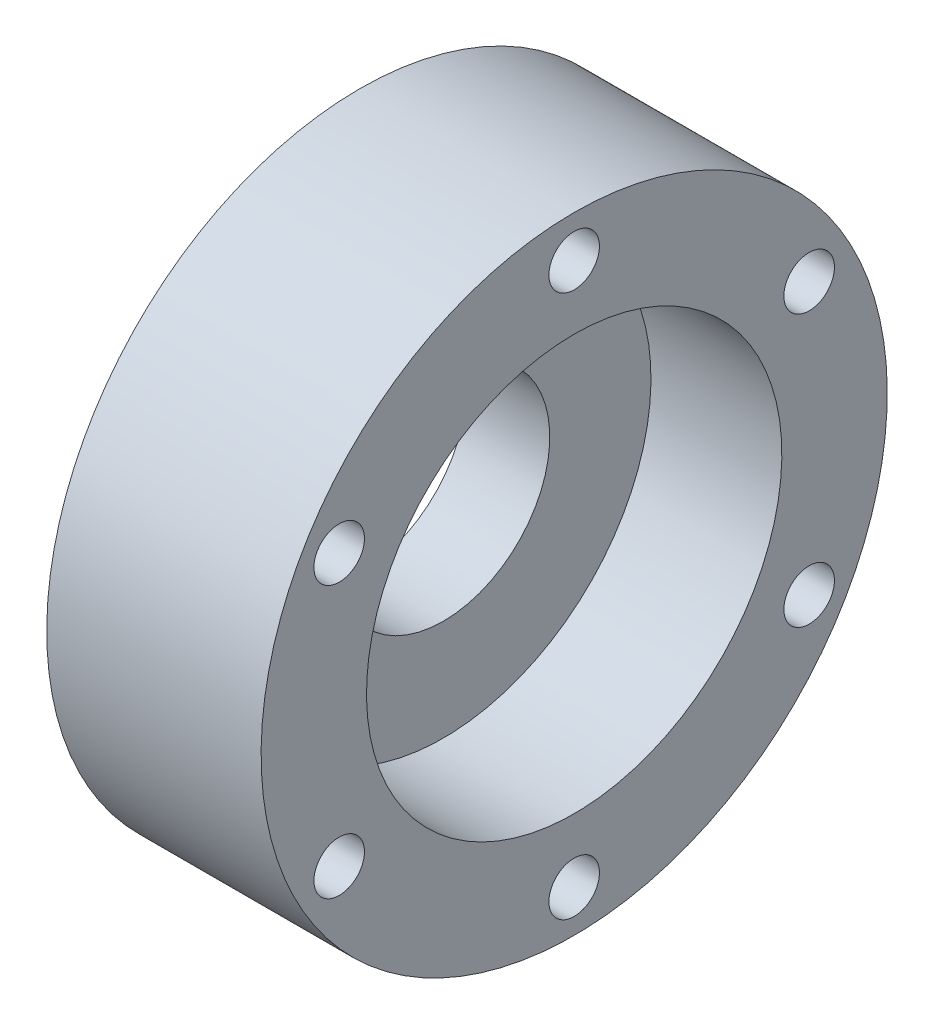
ISO-10303-21;
HEADER;
FILE_DESCRIPTION(('STEP AP214'),'2;1');
FILE_NAME('part.step','',(''),(''),'','','');
FILE_SCHEMA(('AUTOMOTIVE_DESIGN { 1 0 10303 214 1 1 1 1 }'));
ENDSEC;
DATA;
#1=APPLICATION_CONTEXT('core data for automotive mechanical design processes');
#2=APPLICATION_PROTOCOL_DEFINITION('international standard','automotive_design',2000,#1);
#3=PRODUCT_CONTEXT('',#1,'mechanical');
#4=PRODUCT('Part','Part','',(#3));
#5=PRODUCT_RELATED_PRODUCT_CATEGORY('part','',(#4));
#6=PRODUCT_DEFINITION_FORMATION('','',#4);
#7=PRODUCT_DEFINITION_CONTEXT('part definition',#1,'design');
#8=PRODUCT_DEFINITION('design','',#6,#7);
#9=PRODUCT_DEFINITION_SHAPE('','',#8);
#10=(LENGTH_UNIT() NAMED_UNIT(*) SI_UNIT(.MILLI.,.METRE.));
#11=(NAMED_UNIT(*) PLANE_ANGLE_UNIT() SI_UNIT($,.RADIAN.));
#12=(NAMED_UNIT(*) SI_UNIT($,.STERADIAN.) SOLID_ANGLE_UNIT());
#13=UNCERTAINTY_MEASURE_WITH_UNIT(LENGTH_MEASURE(1.E-05),#10,'distance_accuracy_value','');
#14=(GEOMETRIC_REPRESENTATION_CONTEXT(3) GLOBAL_UNCERTAINTY_ASSIGNED_CONTEXT((#13)) GLOBAL_UNIT_ASSIGNED_CONTEXT((#10,
#11,#12)) REPRESENTATION_CONTEXT('',''));
#15=CARTESIAN_POINT('',(0.,0.,0.));
#16=DIRECTION('',(0.,0.,1.));
#17=DIRECTION('',(1.,0.,0.));
#18=AXIS2_PLACEMENT_3D('',#15,#16,#17);
#19=CARTESIAN_POINT('',(0.,0.,0.));
#20=DIRECTION('',(-1.,0.,0.));
#21=DIRECTION('',(0.,-1.,0.));
#22=AXIS2_PLACEMENT_3D('',#19,#20,#21);
#23=PLANE('',#22);
#24=CARTESIAN_POINT('',(0.,16.51,0.));
#25=DIRECTION('',(-1.,0.,0.));
#26=DIRECTION('',(0.,-1.,0.));
#27=AXIS2_PLACEMENT_3D('',#24,#25,#26);
#28=CIRCLE('',#27,1.53814530793123);
#29=CARTESIAN_POINT('',(0.,14.9718546920688,0.));
#30=VERTEX_POINT('',#29);
#31=EDGE_CURVE('E78',#30,#30,#28,.T.);
#32=ORIENTED_EDGE('',*,*,#31,.F.);
#33=EDGE_LOOP('',(#32));
#34=FACE_BOUND('',#33,.T.);
#35=CARTESIAN_POINT('',(0.,8.2549999999992,-14.2980794164806));
#36=DIRECTION('',(-1.,0.,0.));
#37=DIRECTION('',(0.,-1.,0.));
#38=AXIS2_PLACEMENT_3D('',#35,#36,#37);
#39=CIRCLE('',#38,1.53814530793123);
#40=CARTESIAN_POINT('',(0.,6.71685469206797,-14.2980794164806));
#41=VERTEX_POINT('',#40);
#42=EDGE_CURVE('E79',#41,#41,#39,.T.);
#43=ORIENTED_EDGE('',*,*,#42,.F.);
#44=EDGE_LOOP('',(#43));
#45=FACE_BOUND('',#44,.T.);
#46=CARTESIAN_POINT('',(0.,-8.2550000000008,-14.2980794164797));
#47=DIRECTION('',(-1.,0.,0.));
#48=DIRECTION('',(0.,-1.,0.));
#49=AXIS2_PLACEMENT_3D('',#46,#47,#48);
#50=CIRCLE('',#49,1.53814530793123);
#51=CARTESIAN_POINT('',(0.,-9.79314530793203,-14.2980794164797));
#52=VERTEX_POINT('',#51);
#53=EDGE_CURVE('E53',#52,#52,#50,.T.);
#54=ORIENTED_EDGE('',*,*,#53,.F.);
#55=EDGE_LOOP('',(#54));
#56=FACE_BOUND('',#55,.T.);
#57=CARTESIAN_POINT('',(0.,-16.51,1.83496397435458E-12));
#58=DIRECTION('',(-1.,0.,0.));
#59=DIRECTION('',(0.,-1.,0.));
#60=AXIS2_PLACEMENT_3D('',#57,#58,#59);
#61=CIRCLE('',#60,1.53814530793123);
#62=CARTESIAN_POINT('',(0.,-18.0481453079312,1.83496397435458E-12));
#63=VERTEX_POINT('',#62);
#64=EDGE_CURVE('E60',#63,#63,#61,.T.);
#65=ORIENTED_EDGE('',*,*,#64,.F.);
#66=EDGE_LOOP('',(#65));
#67=FACE_BOUND('',#66,.T.);
#68=CARTESIAN_POINT('',(0.,-8.2549999999992,14.2980794164825));
#69=DIRECTION('',(-1.,0.,0.));
#70=DIRECTION('',(0.,-1.,0.));
#71=AXIS2_PLACEMENT_3D('',#68,#69,#70);
#72=CIRCLE('',#71,1.53814530793122);
#73=CARTESIAN_POINT('',(0.,-9.79314530793043,14.2980794164825));
#74=VERTEX_POINT('',#73);
#75=EDGE_CURVE('E66',#74,#74,#72,.T.);
#76=ORIENTED_EDGE('',*,*,#75,.F.);
#77=EDGE_LOOP('',(#76));
#78=FACE_BOUND('',#77,.T.);
#79=CARTESIAN_POINT('',(0.,8.2550000000008,14.2980794164815));
#80=DIRECTION('',(-1.,0.,0.));
#81=DIRECTION('',(0.,-1.,0.));
#82=AXIS2_PLACEMENT_3D('',#79,#80,#81);
#83=CIRCLE('',#82,1.53814530793123);
#84=CARTESIAN_POINT('',(0.,6.71685469206957,14.2980794164815));
#85=VERTEX_POINT('',#84);
#86=EDGE_CURVE('E72',#85,#85,#83,.T.);
#87=ORIENTED_EDGE('',*,*,#86,.F.);
#88=EDGE_LOOP('',(#87));
#89=FACE_BOUND('',#88,.T.);
#90=CARTESIAN_POINT('',(0.,0.,0.));
#91=DIRECTION('',(-1.,0.,0.));
#92=DIRECTION('',(0.,-1.,0.));
#93=AXIS2_PLACEMENT_3D('',#90,#91,#92);
#94=CIRCLE('',#93,6.477);
#95=CARTESIAN_POINT('',(0.,-6.477,0.));
#96=VERTEX_POINT('',#95);
#97=EDGE_CURVE('E49',#96,#96,#94,.T.);
#98=ORIENTED_EDGE('',*,*,#97,.F.);
#99=EDGE_LOOP('',(#98));
#100=FACE_BOUND('',#99,.T.);
#101=CARTESIAN_POINT('',(0.,0.,0.));
#102=DIRECTION('',(1.,0.,0.));
#103=DIRECTION('',(0.,1.,0.));
#104=AXIS2_PLACEMENT_3D('',#101,#102,#103);
#105=CIRCLE('',#104,19.05);
#106=CARTESIAN_POINT('',(0.,19.05,0.));
#107=VERTEX_POINT('',#106);
#108=EDGE_CURVE('E10',#107,#107,#105,.T.);
#109=ORIENTED_EDGE('',*,*,#108,.F.);
#110=EDGE_LOOP('',(#109));
#111=FACE_BOUND('',#110,.T.);
#112=ADVANCED_FACE('F30',(#34,#45,#56,#67,#78,#89,#100,#111),#23,.T.);
#113=CARTESIAN_POINT('',(5.08,0.,0.));
#114=DIRECTION('',(1.,0.,0.));
#115=DIRECTION('',(0.,1.,0.));
#116=AXIS2_PLACEMENT_3D('',#113,#114,#115);
#117=CYLINDRICAL_SURFACE('',#116,19.05);
#118=ORIENTED_EDGE('',*,*,#108,.T.);
#119=EDGE_LOOP('',(#118));
#120=FACE_BOUND('',#119,.T.);
#121=CARTESIAN_POINT('',(13.0429,0.,0.));
#122=DIRECTION('',(1.,0.,0.));
#123=DIRECTION('',(0.,1.,0.));
#124=AXIS2_PLACEMENT_3D('',#121,#122,#123);
#125=CIRCLE('',#124,19.05);
#126=CARTESIAN_POINT('',(13.0429,19.05,0.));
#127=VERTEX_POINT('',#126);
#128=EDGE_CURVE('E37',#127,#127,#125,.T.);
#129=ORIENTED_EDGE('',*,*,#128,.F.);
#130=EDGE_LOOP('',(#129));
#131=FACE_BOUND('',#130,.T.);
#132=ADVANCED_FACE('F101',(#120,#131),#117,.T.);
#133=CARTESIAN_POINT('',(13.0429,19.05,0.));
#134=DIRECTION('',(1.,0.,0.));
#135=DIRECTION('',(0.,1.,0.));
#136=AXIS2_PLACEMENT_3D('',#133,#134,#135);
#137=PLANE('',#136);
#138=CARTESIAN_POINT('',(13.0429,16.51,0.));
#139=DIRECTION('',(-1.,0.,0.));
#140=DIRECTION('',(0.,-1.,0.));
#141=AXIS2_PLACEMENT_3D('',#138,#139,#140);
#142=CIRCLE('',#141,1.53814530793123);
#143=CARTESIAN_POINT('',(13.0429,14.9718546920688,0.));
#144=VERTEX_POINT('',#143);
#145=EDGE_CURVE('E52',#144,#144,#142,.T.);
#146=ORIENTED_EDGE('',*,*,#145,.T.);
#147=EDGE_LOOP('',(#146));
#148=FACE_BOUND('',#147,.T.);
#149=CARTESIAN_POINT('',(13.0429,8.2549999999992,-14.2980794164806));
#150=DIRECTION('',(-1.,0.,0.));
#151=DIRECTION('',(0.,-1.,0.));
#152=AXIS2_PLACEMENT_3D('',#149,#150,#151);
#153=CIRCLE('',#152,1.53814530793123);
#154=CARTESIAN_POINT('',(13.0429,6.71685469206797,-14.2980794164806));
#155=VERTEX_POINT('',#154);
#156=EDGE_CURVE('E57',#155,#155,#153,.T.);
#157=ORIENTED_EDGE('',*,*,#156,.T.);
#158=EDGE_LOOP('',(#157));
#159=FACE_BOUND('',#158,.T.);
#160=CARTESIAN_POINT('',(13.0429,-8.2550000000008,-14.2980794164797));
#161=DIRECTION('',(-1.,0.,0.));
#162=DIRECTION('',(0.,-1.,0.));
#163=AXIS2_PLACEMENT_3D('',#160,#161,#162);
#164=CIRCLE('',#163,1.53814530793123);
#165=CARTESIAN_POINT('',(13.0429,-9.79314530793203,-14.2980794164797));
#166=VERTEX_POINT('',#165);
#167=EDGE_CURVE('E56',#166,#166,#164,.T.);
#168=ORIENTED_EDGE('',*,*,#167,.T.);
#169=EDGE_LOOP('',(#168));
#170=FACE_BOUND('',#169,.T.);
#171=CARTESIAN_POINT('',(13.0429,-16.51,1.83496397435458E-12));
#172=DIRECTION('',(-1.,0.,0.));
#173=DIRECTION('',(0.,-1.,0.));
#174=AXIS2_PLACEMENT_3D('',#171,#172,#173);
#175=CIRCLE('',#174,1.53814530793123);
#176=CARTESIAN_POINT('',(13.0429,-18.0481453079312,1.83496397435458E-12));
#177=VERTEX_POINT('',#176);
#178=EDGE_CURVE('E63',#177,#177,#175,.T.);
#179=ORIENTED_EDGE('',*,*,#178,.T.);
#180=EDGE_LOOP('',(#179));
#181=FACE_BOUND('',#180,.T.);
#182=CARTESIAN_POINT('',(13.0429,-8.2549999999992,14.2980794164825));
#183=DIRECTION('',(-1.,0.,0.));
#184=DIRECTION('',(0.,-1.,0.));
#185=AXIS2_PLACEMENT_3D('',#182,#183,#184);
#186=CIRCLE('',#185,1.53814530793122);
#187=CARTESIAN_POINT('',(13.0429,-9.79314530793043,14.2980794164825));
#188=VERTEX_POINT('',#187);
#189=EDGE_CURVE('E69',#188,#188,#186,.T.);
#190=ORIENTED_EDGE('',*,*,#189,.T.);
#191=EDGE_LOOP('',(#190));
#192=FACE_BOUND('',#191,.T.);
#193=CARTESIAN_POINT('',(13.0429,8.2550000000008,14.2980794164815));
#194=DIRECTION('',(-1.,0.,0.));
#195=DIRECTION('',(0.,-1.,0.));
#196=AXIS2_PLACEMENT_3D('',#193,#194,#195);
#197=CIRCLE('',#196,1.53814530793123);
#198=CARTESIAN_POINT('',(13.0429,6.71685469206957,14.2980794164815));
#199=VERTEX_POINT('',#198);
#200=EDGE_CURVE('E75',#199,#199,#197,.T.);
#201=ORIENTED_EDGE('',*,*,#200,.T.);
#202=EDGE_LOOP('',(#201));
#203=FACE_BOUND('',#202,.T.);
#204=ORIENTED_EDGE('',*,*,#128,.T.);
#205=EDGE_LOOP('',(#204));
#206=FACE_BOUND('',#205,.T.);
#207=CARTESIAN_POINT('',(13.0429,0.,0.));
#208=DIRECTION('',(1.,0.,0.));
#209=DIRECTION('',(0.,1.,0.));
#210=AXIS2_PLACEMENT_3D('',#207,#208,#209);
#211=CIRCLE('',#210,12.6365);
#212=CARTESIAN_POINT('',(13.0429,12.6365,0.));
#213=VERTEX_POINT('',#212);
#214=EDGE_CURVE('E41',#213,#213,#211,.T.);
#215=ORIENTED_EDGE('',*,*,#214,.F.);
#216=EDGE_LOOP('',(#215));
#217=FACE_BOUND('',#216,.T.);
#218=ADVANCED_FACE('F89',(#148,#159,#170,#181,#192,#203,#206,#217),#137,.T.);
#219=CARTESIAN_POINT('',(5.08,0.,0.));
#220=DIRECTION('',(1.,0.,0.));
#221=DIRECTION('',(0.,1.,0.));
#222=AXIS2_PLACEMENT_3D('',#219,#220,#221);
#223=CYLINDRICAL_SURFACE('',#222,12.6365);
#224=ORIENTED_EDGE('',*,*,#214,.T.);
#225=EDGE_LOOP('',(#224));
#226=FACE_BOUND('',#225,.T.);
#227=CARTESIAN_POINT('',(5.08,0.,0.));
#228=DIRECTION('',(1.,0.,0.));
#229=DIRECTION('',(0.,1.,0.));
#230=AXIS2_PLACEMENT_3D('',#227,#228,#229);
#231=CIRCLE('',#230,12.6365);
#232=CARTESIAN_POINT('',(5.08,12.6365,0.));
#233=VERTEX_POINT('',#232);
#234=EDGE_CURVE('E46',#233,#233,#231,.T.);
#235=ORIENTED_EDGE('',*,*,#234,.F.);
#236=EDGE_LOOP('',(#235));
#237=FACE_BOUND('',#236,.T.);
#238=ADVANCED_FACE('F128',(#226,#237),#223,.F.);
#239=CARTESIAN_POINT('',(5.08,12.6365,0.));
#240=DIRECTION('',(1.,0.,0.));
#241=DIRECTION('',(0.,1.,0.));
#242=AXIS2_PLACEMENT_3D('',#239,#240,#241);
#243=PLANE('',#242);
#244=CARTESIAN_POINT('',(5.08,0.,0.));
#245=DIRECTION('',(1.,0.,0.));
#246=DIRECTION('',(0.,1.,0.));
#247=AXIS2_PLACEMENT_3D('',#244,#245,#246);
#248=CIRCLE('',#247,6.477);
#249=CARTESIAN_POINT('',(5.08,6.477,0.));
#250=VERTEX_POINT('',#249);
#251=EDGE_CURVE('E33',#250,#250,#248,.T.);
#252=ORIENTED_EDGE('',*,*,#251,.F.);
#253=EDGE_LOOP('',(#252));
#254=FACE_BOUND('',#253,.T.);
#255=ORIENTED_EDGE('',*,*,#234,.T.);
#256=EDGE_LOOP('',(#255));
#257=FACE_BOUND('',#256,.T.);
#258=ADVANCED_FACE('F118',(#254,#257),#243,.T.);
#259=CARTESIAN_POINT('',(13.0429,0.,0.));
#260=DIRECTION('',(-1.,0.,0.));
#261=DIRECTION('',(0.,-1.,0.));
#262=AXIS2_PLACEMENT_3D('',#259,#260,#261);
#263=CYLINDRICAL_SURFACE('',#262,6.477);
#264=ORIENTED_EDGE('',*,*,#251,.T.);
#265=EDGE_LOOP('',(#264));
#266=FACE_BOUND('',#265,.T.);
#267=ORIENTED_EDGE('',*,*,#97,.T.);
#268=EDGE_LOOP('',(#267));
#269=FACE_BOUND('',#268,.T.);
#270=ADVANCED_FACE('F115',(#266,#269),#263,.F.);
#271=CARTESIAN_POINT('',(13.0429,8.2550000000008,14.2980794164815));
#272=DIRECTION('',(-1.,0.,0.));
#273=DIRECTION('',(0.,-1.,0.));
#274=AXIS2_PLACEMENT_3D('',#271,#272,#273);
#275=CYLINDRICAL_SURFACE('',#274,1.53814530793123);
#276=ORIENTED_EDGE('',*,*,#200,.F.);
#277=EDGE_LOOP('',(#276));
#278=FACE_BOUND('',#277,.T.);
#279=ORIENTED_EDGE('',*,*,#86,.T.);
#280=EDGE_LOOP('',(#279));
#281=FACE_BOUND('',#280,.T.);
#282=ADVANCED_FACE('F117',(#278,#281),#275,.F.);
#283=CARTESIAN_POINT('',(13.0429,-8.2549999999992,14.2980794164825));
#284=DIRECTION('',(-1.,0.,0.));
#285=DIRECTION('',(0.,-1.,0.));
#286=AXIS2_PLACEMENT_3D('',#283,#284,#285);
#287=CYLINDRICAL_SURFACE('',#286,1.53814530793122);
#288=ORIENTED_EDGE('',*,*,#189,.F.);
#289=EDGE_LOOP('',(#288));
#290=FACE_BOUND('',#289,.T.);
#291=ORIENTED_EDGE('',*,*,#75,.T.);
#292=EDGE_LOOP('',(#291));
#293=FACE_BOUND('',#292,.T.);
#294=ADVANCED_FACE('F125',(#290,#293),#287,.F.);
#295=CARTESIAN_POINT('',(13.0429,-16.51,1.83496397435458E-12));
#296=DIRECTION('',(-1.,0.,0.));
#297=DIRECTION('',(0.,-1.,0.));
#298=AXIS2_PLACEMENT_3D('',#295,#296,#297);
#299=CYLINDRICAL_SURFACE('',#298,1.53814530793123);
#300=ORIENTED_EDGE('',*,*,#178,.F.);
#301=EDGE_LOOP('',(#300));
#302=FACE_BOUND('',#301,.T.);
#303=ORIENTED_EDGE('',*,*,#64,.T.);
#304=EDGE_LOOP('',(#303));
#305=FACE_BOUND('',#304,.T.);
#306=ADVANCED_FACE('F194',(#302,#305),#299,.F.);
#307=CARTESIAN_POINT('',(13.0429,-8.2550000000008,-14.2980794164797));
#308=DIRECTION('',(-1.,0.,0.));
#309=DIRECTION('',(0.,-1.,0.));
#310=AXIS2_PLACEMENT_3D('',#307,#308,#309);
#311=CYLINDRICAL_SURFACE('',#310,1.53814530793123);
#312=ORIENTED_EDGE('',*,*,#167,.F.);
#313=EDGE_LOOP('',(#312));
#314=FACE_BOUND('',#313,.T.);
#315=ORIENTED_EDGE('',*,*,#53,.T.);
#316=EDGE_LOOP('',(#315));
#317=FACE_BOUND('',#316,.T.);
#318=ADVANCED_FACE('F133',(#314,#317),#311,.F.);
#319=CARTESIAN_POINT('',(13.0429,8.2549999999992,-14.2980794164806));
#320=DIRECTION('',(-1.,0.,0.));
#321=DIRECTION('',(0.,-1.,0.));
#322=AXIS2_PLACEMENT_3D('',#319,#320,#321);
#323=CYLINDRICAL_SURFACE('',#322,1.53814530793123);
#324=ORIENTED_EDGE('',*,*,#156,.F.);
#325=EDGE_LOOP('',(#324));
#326=FACE_BOUND('',#325,.T.);
#327=ORIENTED_EDGE('',*,*,#42,.T.);
#328=EDGE_LOOP('',(#327));
#329=FACE_BOUND('',#328,.T.);
#330=ADVANCED_FACE('F95',(#326,#329),#323,.F.);
#331=CARTESIAN_POINT('',(13.0429,16.51,0.));
#332=DIRECTION('',(-1.,0.,0.));
#333=DIRECTION('',(0.,-1.,0.));
#334=AXIS2_PLACEMENT_3D('',#331,#332,#333);
#335=CYLINDRICAL_SURFACE('',#334,1.53814530793123);
#336=ORIENTED_EDGE('',*,*,#145,.F.);
#337=EDGE_LOOP('',(#336));
#338=FACE_BOUND('',#337,.T.);
#339=ORIENTED_EDGE('',*,*,#31,.T.);
#340=EDGE_LOOP('',(#339));
#341=FACE_BOUND('',#340,.T.);
#342=ADVANCED_FACE('F92',(#338,#341),#335,.F.);
#343=CLOSED_SHELL('',(#112,#132,#218,#238,#258,#270,#282,#294,#306,#318,#330,#342));
#344=MANIFOLD_SOLID_BREP('B2',#343);
#345=ADVANCED_BREP_SHAPE_REPRESENTATION('',(#18,#344),#14);
#346=SHAPE_DEFINITION_REPRESENTATION(#9,#345);
ENDSEC;
END-ISO-10303-21;
